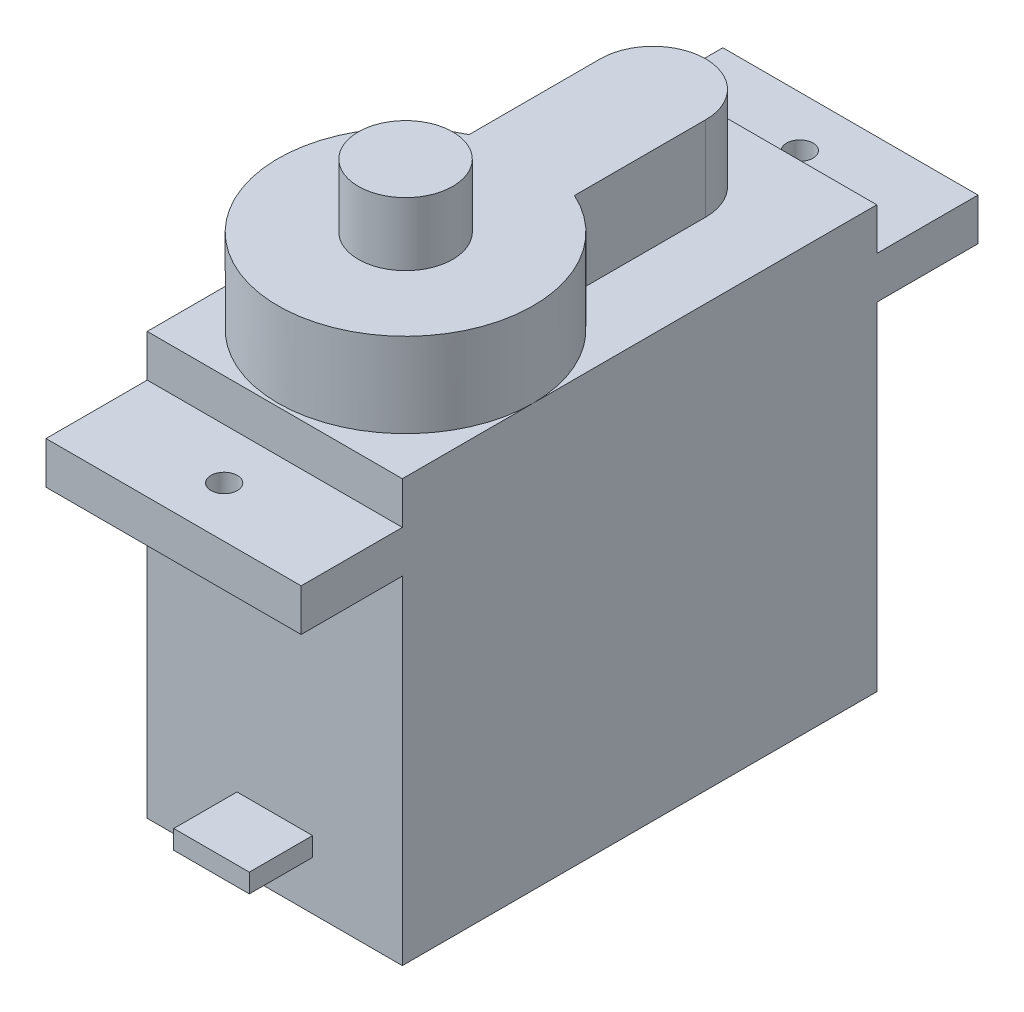
ISO-10303-21;
HEADER;
FILE_DESCRIPTION(('STEP AP214'),'2;1');
FILE_NAME('part.step','',(''),(''),'','','');
FILE_SCHEMA(('AUTOMOTIVE_DESIGN { 1 0 10303 214 1 1 1 1 }'));
ENDSEC;
DATA;
#1=APPLICATION_CONTEXT('core data for automotive mechanical design processes');
#2=APPLICATION_PROTOCOL_DEFINITION('international standard','automotive_design',2000,#1);
#3=PRODUCT_CONTEXT('',#1,'mechanical');
#4=PRODUCT('Part','Part','',(#3));
#5=PRODUCT_RELATED_PRODUCT_CATEGORY('part','',(#4));
#6=PRODUCT_DEFINITION_FORMATION('','',#4);
#7=PRODUCT_DEFINITION_CONTEXT('part definition',#1,'design');
#8=PRODUCT_DEFINITION('design','',#6,#7);
#9=PRODUCT_DEFINITION_SHAPE('','',#8);
#10=(LENGTH_UNIT() NAMED_UNIT(*) SI_UNIT(.MILLI.,.METRE.));
#11=(NAMED_UNIT(*) PLANE_ANGLE_UNIT() SI_UNIT($,.RADIAN.));
#12=(NAMED_UNIT(*) SI_UNIT($,.STERADIAN.) SOLID_ANGLE_UNIT());
#13=UNCERTAINTY_MEASURE_WITH_UNIT(LENGTH_MEASURE(1.E-05),#10,'distance_accuracy_value','');
#14=(GEOMETRIC_REPRESENTATION_CONTEXT(3) GLOBAL_UNCERTAINTY_ASSIGNED_CONTEXT((#13)) GLOBAL_UNIT_ASSIGNED_CONTEXT((#10,
#11,#12)) REPRESENTATION_CONTEXT('',''));
#15=CARTESIAN_POINT('',(0.,0.,0.));
#16=DIRECTION('',(0.,0.,1.));
#17=DIRECTION('',(1.,0.,0.));
#18=AXIS2_PLACEMENT_3D('',#15,#16,#17);
#19=CARTESIAN_POINT('',(-0.323958333333324,20.,22.6119791666667));
#20=DIRECTION('',(0.,0.,-1.));
#21=DIRECTION('',(-1.,0.,0.));
#22=AXIS2_PLACEMENT_3D('',#19,#20,#21);
#23=PLANE('',#22);
#24=DIRECTION('',(1.,0.,0.));
#25=VECTOR('',#24,1.);
#26=CARTESIAN_POINT('',(-0.323958333333323,16.,22.6119791666667));
#27=LINE('',#26,#25);
#28=CARTESIAN_POINT('',(-0.323958333333324,16.,22.6119791666667));
#29=VERTEX_POINT('',#28);
#30=CARTESIAN_POINT('',(11.7760416666667,16.,22.6119791666667));
#31=VERTEX_POINT('',#30);
#32=EDGE_CURVE('E279',#29,#31,#27,.T.);
#33=ORIENTED_EDGE('',*,*,#32,.F.);
#34=DIRECTION('',(0.,-1.,0.));
#35=VECTOR('',#34,1.);
#36=CARTESIAN_POINT('',(-0.323958333333324,20.,22.6119791666667));
#37=LINE('',#36,#35);
#38=CARTESIAN_POINT('',(-0.323958333333324,0.,22.6119791666667));
#39=VERTEX_POINT('',#38);
#40=EDGE_CURVE('E340',#29,#39,#37,.T.);
#41=ORIENTED_EDGE('',*,*,#40,.T.);
#42=DIRECTION('',(1.,0.,0.));
#43=VECTOR('',#42,1.);
#44=CARTESIAN_POINT('',(-0.323958333333324,0.,22.6119791666667));
#45=LINE('',#44,#43);
#46=CARTESIAN_POINT('',(11.7760416666667,0.,22.6119791666667));
#47=VERTEX_POINT('',#46);
#48=EDGE_CURVE('E322',#39,#47,#45,.T.);
#49=ORIENTED_EDGE('',*,*,#48,.T.);
#50=DIRECTION('',(0.,-1.,0.));
#51=VECTOR('',#50,1.);
#52=CARTESIAN_POINT('',(11.7760416666667,20.,22.6119791666667));
#53=LINE('',#52,#51);
#54=EDGE_CURVE('E337',#31,#47,#53,.T.);
#55=ORIENTED_EDGE('',*,*,#54,.F.);
#56=EDGE_LOOP('',(#33,#41,#49,#55));
#57=FACE_BOUND('',#56,.T.);
#58=DIRECTION('',(0.,1.,0.));
#59=VECTOR('',#58,1.);
#60=CARTESIAN_POINT('',(7.51809267119526,3.21293798361964,22.6119791666667));
#61=LINE('',#60,#59);
#62=CARTESIAN_POINT('',(7.51809267119526,2.31691248135534,22.6119791666667));
#63=VERTEX_POINT('',#62);
#64=CARTESIAN_POINT('',(7.51809267119526,3.21293798361964,22.6119791666667));
#65=VERTEX_POINT('',#64);
#66=EDGE_CURVE('E200',#63,#65,#61,.T.);
#67=ORIENTED_EDGE('',*,*,#66,.F.);
#68=DIRECTION('',(1.,0.,0.));
#69=VECTOR('',#68,1.);
#70=CARTESIAN_POINT('',(3.93399066213809,2.31691248135534,22.6119791666667));
#71=LINE('',#70,#69);
#72=CARTESIAN_POINT('',(3.93399066213809,2.31691248135534,22.6119791666667));
#73=VERTEX_POINT('',#72);
#74=EDGE_CURVE('E197',#73,#63,#71,.T.);
#75=ORIENTED_EDGE('',*,*,#74,.F.);
#76=DIRECTION('',(0.,-1.,0.));
#77=VECTOR('',#76,1.);
#78=CARTESIAN_POINT('',(3.93399066213809,3.21293798361964,22.6119791666667));
#79=LINE('',#78,#77);
#80=CARTESIAN_POINT('',(3.93399066213809,3.21293798361964,22.6119791666667));
#81=VERTEX_POINT('',#80);
#82=EDGE_CURVE('E57',#81,#73,#79,.T.);
#83=ORIENTED_EDGE('',*,*,#82,.F.);
#84=DIRECTION('',(-1.,0.,0.));
#85=VECTOR('',#84,1.);
#86=CARTESIAN_POINT('',(3.93399066213809,3.21293798361964,22.6119791666667));
#87=LINE('',#86,#85);
#88=EDGE_CURVE('E52',#65,#81,#87,.T.);
#89=ORIENTED_EDGE('',*,*,#88,.F.);
#90=EDGE_LOOP('',(#67,#75,#83,#89));
#91=FACE_BOUND('',#90,.T.);
#92=ADVANCED_FACE('F35',(#57,#91),#23,.F.);
#93=CARTESIAN_POINT('',(0.,20.,0.));
#94=DIRECTION('',(0.,1.,0.));
#95=DIRECTION('',(0.,0.,1.));
#96=AXIS2_PLACEMENT_3D('',#93,#94,#95);
#97=PLANE('',#96);
#98=CARTESIAN_POINT('',(5.72604166666668,20.,16.4100907388871));
#99=DIRECTION('',(0.,1.,0.));
#100=DIRECTION('',(0.,0.,1.));
#101=AXIS2_PLACEMENT_3D('',#98,#99,#100);
#102=CIRCLE('',#101,6.05);
#103=CARTESIAN_POINT('',(3.22604166666668,20.,10.900780437225));
#104=VERTEX_POINT('',#103);
#105=CARTESIAN_POINT('',(-0.323958333333323,20.,16.4100907388871));
#106=VERTEX_POINT('',#105);
#107=EDGE_CURVE('E204',#104,#106,#102,.T.);
#108=ORIENTED_EDGE('',*,*,#107,.F.);
#109=DIRECTION('',(0.,0.,1.));
#110=VECTOR('',#109,1.);
#111=CARTESIAN_POINT('',(3.22604166666668,20.,4.67601741229884));
#112=LINE('',#111,#110);
#113=CARTESIAN_POINT('',(3.22604166666668,20.,4.67601741229884));
#114=VERTEX_POINT('',#113);
#115=EDGE_CURVE('E214',#114,#104,#112,.T.);
#116=ORIENTED_EDGE('',*,*,#115,.F.);
#117=CARTESIAN_POINT('',(5.72604166666667,20.,4.67601746270815));
#118=DIRECTION('',(0.,1.,0.));
#119=DIRECTION('',(0.,0.,1.));
#120=AXIS2_PLACEMENT_3D('',#117,#118,#119);
#121=CIRCLE('',#120,2.5);
#122=CARTESIAN_POINT('',(8.22604166666667,20.,4.67601751311747));
#123=VERTEX_POINT('',#122);
#124=EDGE_CURVE('E227',#123,#114,#121,.T.);
#125=ORIENTED_EDGE('',*,*,#124,.F.);
#126=DIRECTION('',(0.,0.,-1.));
#127=VECTOR('',#126,1.);
#128=CARTESIAN_POINT('',(8.22604166666667,20.,4.67601751311747));
#129=LINE('',#128,#127);
#130=CARTESIAN_POINT('',(8.22604166666668,20.,10.900780437225));
#131=VERTEX_POINT('',#130);
#132=EDGE_CURVE('E223',#131,#123,#129,.T.);
#133=ORIENTED_EDGE('',*,*,#132,.F.);
#134=CARTESIAN_POINT('',(11.7760416666667,20.,16.4100907388871));
#135=VERTEX_POINT('',#134);
#136=EDGE_CURVE('E224',#135,#131,#102,.T.);
#137=ORIENTED_EDGE('',*,*,#136,.F.);
#138=DIRECTION('',(0.,0.,-1.));
#139=VECTOR('',#138,1.);
#140=CARTESIAN_POINT('',(11.7760416666667,20.,0.111979166666672));
#141=LINE('',#140,#139);
#142=CARTESIAN_POINT('',(11.7760416666667,20.,0.111979166666672));
#143=VERTEX_POINT('',#142);
#144=EDGE_CURVE('E313',#135,#143,#141,.T.);
#145=ORIENTED_EDGE('',*,*,#144,.T.);
#146=DIRECTION('',(-1.,0.,0.));
#147=VECTOR('',#146,1.);
#148=CARTESIAN_POINT('',(-0.323958333333326,20.,0.111979166666672));
#149=LINE('',#148,#147);
#150=CARTESIAN_POINT('',(-0.323958333333326,20.,0.111979166666672));
#151=VERTEX_POINT('',#150);
#152=EDGE_CURVE('E317',#143,#151,#149,.T.);
#153=ORIENTED_EDGE('',*,*,#152,.T.);
#154=DIRECTION('',(0.,0.,1.));
#155=VECTOR('',#154,1.);
#156=CARTESIAN_POINT('',(-0.323958333333326,20.,0.111979166666672));
#157=LINE('',#156,#155);
#158=EDGE_CURVE('E307',#151,#106,#157,.T.);
#159=ORIENTED_EDGE('',*,*,#158,.T.);
#160=EDGE_LOOP('',(#108,#116,#125,#133,#137,#145,#153,#159));
#161=FACE_BOUND('',#160,.T.);
#162=ADVANCED_FACE('F391',(#161),#97,.T.);
#163=CARTESIAN_POINT('',(-0.323958333333326,20.,0.111979166666672));
#164=DIRECTION('',(0.,0.,1.));
#165=DIRECTION('',(1.,0.,0.));
#166=AXIS2_PLACEMENT_3D('',#163,#164,#165);
#167=PLANE('',#166);
#168=DIRECTION('',(1.,0.,0.));
#169=VECTOR('',#168,1.);
#170=CARTESIAN_POINT('',(-0.323958333333328,18.,0.111979166666672));
#171=LINE('',#170,#169);
#172=CARTESIAN_POINT('',(-0.323958333333326,18.,0.111979166666672));
#173=VERTEX_POINT('',#172);
#174=CARTESIAN_POINT('',(11.7760416666667,18.,0.111979166666672));
#175=VERTEX_POINT('',#174);
#176=EDGE_CURVE('E252',#173,#175,#171,.T.);
#177=ORIENTED_EDGE('',*,*,#176,.F.);
#178=DIRECTION('',(0.,-1.,0.));
#179=VECTOR('',#178,1.);
#180=CARTESIAN_POINT('',(-0.323958333333326,20.,0.111979166666672));
#181=LINE('',#180,#179);
#182=EDGE_CURVE('E331',#151,#173,#181,.T.);
#183=ORIENTED_EDGE('',*,*,#182,.F.);
#184=ORIENTED_EDGE('',*,*,#152,.F.);
#185=DIRECTION('',(0.,-1.,0.));
#186=VECTOR('',#185,1.);
#187=CARTESIAN_POINT('',(11.7760416666667,20.,0.111979166666672));
#188=LINE('',#187,#186);
#189=EDGE_CURVE('E335',#143,#175,#188,.T.);
#190=ORIENTED_EDGE('',*,*,#189,.T.);
#191=EDGE_LOOP('',(#177,#183,#184,#190));
#192=FACE_BOUND('',#191,.T.);
#193=ADVANCED_FACE('F422',(#192),#167,.F.);
#194=DIRECTION('',(-1.,0.,0.));
#195=VECTOR('',#194,1.);
#196=CARTESIAN_POINT('',(11.7760416666667,16.,0.11197916666667));
#197=LINE('',#196,#195);
#198=CARTESIAN_POINT('',(11.7760416666667,16.,0.111979166666672));
#199=VERTEX_POINT('',#198);
#200=CARTESIAN_POINT('',(-0.323958333333327,16.,0.111979166666672));
#201=VERTEX_POINT('',#200);
#202=EDGE_CURVE('E257',#199,#201,#197,.T.);
#203=ORIENTED_EDGE('',*,*,#202,.F.);
#204=CARTESIAN_POINT('',(11.7760416666667,0.,0.111979166666672));
#205=VERTEX_POINT('',#204);
#206=EDGE_CURVE('E334',#199,#205,#188,.T.);
#207=ORIENTED_EDGE('',*,*,#206,.T.);
#208=DIRECTION('',(-1.,0.,0.));
#209=VECTOR('',#208,1.);
#210=CARTESIAN_POINT('',(-0.323958333333326,0.,0.111979166666672));
#211=LINE('',#210,#209);
#212=CARTESIAN_POINT('',(-0.323958333333326,0.,0.111979166666672));
#213=VERTEX_POINT('',#212);
#214=EDGE_CURVE('E328',#205,#213,#211,.T.);
#215=ORIENTED_EDGE('',*,*,#214,.T.);
#216=EDGE_CURVE('E319',#201,#213,#181,.T.);
#217=ORIENTED_EDGE('',*,*,#216,.F.);
#218=EDGE_LOOP('',(#203,#207,#215,#217));
#219=FACE_BOUND('',#218,.T.);
#220=ADVANCED_FACE('F359',(#219),#167,.F.);
#221=DIRECTION('',(-1.,0.,0.));
#222=VECTOR('',#221,1.);
#223=CARTESIAN_POINT('',(-0.323958333333324,18.,22.6119791666667));
#224=LINE('',#223,#222);
#225=CARTESIAN_POINT('',(11.7760416666667,18.,22.6119791666667));
#226=VERTEX_POINT('',#225);
#227=CARTESIAN_POINT('',(-0.323958333333324,18.,22.6119791666667));
#228=VERTEX_POINT('',#227);
#229=EDGE_CURVE('E284',#226,#228,#224,.T.);
#230=ORIENTED_EDGE('',*,*,#229,.F.);
#231=CARTESIAN_POINT('',(11.7760416666667,20.,22.6119791666667));
#232=VERTEX_POINT('',#231);
#233=EDGE_CURVE('E338',#232,#226,#53,.T.);
#234=ORIENTED_EDGE('',*,*,#233,.F.);
#235=DIRECTION('',(1.,0.,0.));
#236=VECTOR('',#235,1.);
#237=CARTESIAN_POINT('',(-0.323958333333324,20.,22.6119791666667));
#238=LINE('',#237,#236);
#239=CARTESIAN_POINT('',(-0.323958333333324,20.,22.6119791666667));
#240=VERTEX_POINT('',#239);
#241=EDGE_CURVE('E310',#240,#232,#238,.T.);
#242=ORIENTED_EDGE('',*,*,#241,.F.);
#243=EDGE_CURVE('E341',#240,#228,#37,.T.);
#244=ORIENTED_EDGE('',*,*,#243,.T.);
#245=EDGE_LOOP('',(#230,#234,#242,#244));
#246=FACE_BOUND('',#245,.T.);
#247=ADVANCED_FACE('F377',(#246),#23,.F.);
#248=CARTESIAN_POINT('',(-0.323958333333326,20.,0.111979166666672));
#249=DIRECTION('',(1.,0.,0.));
#250=DIRECTION('',(0.,0.,-1.));
#251=AXIS2_PLACEMENT_3D('',#248,#249,#250);
#252=PLANE('',#251);
#253=DIRECTION('',(0.,0.,1.));
#254=VECTOR('',#253,1.);
#255=CARTESIAN_POINT('',(-0.323958333333326,0.,0.111979166666672));
#256=LINE('',#255,#254);
#257=EDGE_CURVE('E306',#213,#39,#256,.T.);
#258=ORIENTED_EDGE('',*,*,#257,.T.);
#259=ORIENTED_EDGE('',*,*,#40,.F.);
#260=DIRECTION('',(0.,0.,-1.));
#261=VECTOR('',#260,1.);
#262=CARTESIAN_POINT('',(-0.323958333333323,16.,27.4119791666667));
#263=LINE('',#262,#261);
#264=CARTESIAN_POINT('',(-0.323958333333323,16.,27.4119791666667));
#265=VERTEX_POINT('',#264);
#266=EDGE_CURVE('E303',#265,#29,#263,.T.);
#267=ORIENTED_EDGE('',*,*,#266,.F.);
#268=DIRECTION('',(0.,-1.,0.));
#269=VECTOR('',#268,1.);
#270=CARTESIAN_POINT('',(-0.323958333333324,18.,27.4119791666667));
#271=LINE('',#270,#269);
#272=CARTESIAN_POINT('',(-0.323958333333324,18.,27.4119791666667));
#273=VERTEX_POINT('',#272);
#274=EDGE_CURVE('E280',#273,#265,#271,.T.);
#275=ORIENTED_EDGE('',*,*,#274,.F.);
#276=DIRECTION('',(0.,0.,-1.));
#277=VECTOR('',#276,1.);
#278=CARTESIAN_POINT('',(-0.323958333333324,18.,27.4119791666667));
#279=LINE('',#278,#277);
#280=EDGE_CURVE('E290',#273,#228,#279,.T.);
#281=ORIENTED_EDGE('',*,*,#280,.T.);
#282=ORIENTED_EDGE('',*,*,#243,.F.);
#283=EDGE_CURVE('E311',#106,#240,#157,.T.);
#284=ORIENTED_EDGE('',*,*,#283,.F.);
#285=ORIENTED_EDGE('',*,*,#158,.F.);
#286=ORIENTED_EDGE('',*,*,#182,.T.);
#287=DIRECTION('',(0.,0.,1.));
#288=VECTOR('',#287,1.);
#289=CARTESIAN_POINT('',(-0.323958333333328,18.,-4.68802083333333));
#290=LINE('',#289,#288);
#291=CARTESIAN_POINT('',(-0.323958333333328,18.,-4.68802083333333));
#292=VERTEX_POINT('',#291);
#293=EDGE_CURVE('E263',#292,#173,#290,.T.);
#294=ORIENTED_EDGE('',*,*,#293,.F.);
#295=DIRECTION('',(0.,1.,0.));
#296=VECTOR('',#295,1.);
#297=CARTESIAN_POINT('',(-0.323958333333328,16.,-4.68802083333333));
#298=LINE('',#297,#296);
#299=CARTESIAN_POINT('',(-0.323958333333328,16.,-4.68802083333333));
#300=VERTEX_POINT('',#299);
#301=EDGE_CURVE('E261',#300,#292,#298,.T.);
#302=ORIENTED_EDGE('',*,*,#301,.F.);
#303=DIRECTION('',(0.,0.,1.));
#304=VECTOR('',#303,1.);
#305=CARTESIAN_POINT('',(-0.323958333333328,16.,-4.68802083333333));
#306=LINE('',#305,#304);
#307=EDGE_CURVE('E270',#300,#201,#306,.T.);
#308=ORIENTED_EDGE('',*,*,#307,.T.);
#309=ORIENTED_EDGE('',*,*,#216,.T.);
#310=EDGE_LOOP('',(#258,#259,#267,#275,#281,#282,#284,#285,#286,#294,#302,#308,#309));
#311=FACE_BOUND('',#310,.T.);
#312=ADVANCED_FACE('F37',(#311),#252,.F.);
#313=CARTESIAN_POINT('',(11.7760416666667,20.,0.111979166666672));
#314=DIRECTION('',(-1.,0.,0.));
#315=DIRECTION('',(0.,0.,1.));
#316=AXIS2_PLACEMENT_3D('',#313,#314,#315);
#317=PLANE('',#316);
#318=DIRECTION('',(0.,0.,-1.));
#319=VECTOR('',#318,1.);
#320=CARTESIAN_POINT('',(11.7760416666667,0.,0.111979166666672));
#321=LINE('',#320,#319);
#322=EDGE_CURVE('E325',#47,#205,#321,.T.);
#323=ORIENTED_EDGE('',*,*,#322,.T.);
#324=ORIENTED_EDGE('',*,*,#206,.F.);
#325=DIRECTION('',(0.,0.,1.));
#326=VECTOR('',#325,1.);
#327=CARTESIAN_POINT('',(11.7760416666667,16.,-4.68802083333333));
#328=LINE('',#327,#326);
#329=CARTESIAN_POINT('',(11.7760416666667,16.,-4.68802083333333));
#330=VERTEX_POINT('',#329);
#331=EDGE_CURVE('E273',#330,#199,#328,.T.);
#332=ORIENTED_EDGE('',*,*,#331,.F.);
#333=DIRECTION('',(0.,-1.,0.));
#334=VECTOR('',#333,1.);
#335=CARTESIAN_POINT('',(11.7760416666667,18.,-4.68802083333333));
#336=LINE('',#335,#334);
#337=CARTESIAN_POINT('',(11.7760416666667,18.,-4.68802083333333));
#338=VERTEX_POINT('',#337);
#339=EDGE_CURVE('E256',#338,#330,#336,.T.);
#340=ORIENTED_EDGE('',*,*,#339,.F.);
#341=DIRECTION('',(0.,0.,1.));
#342=VECTOR('',#341,1.);
#343=CARTESIAN_POINT('',(11.7760416666667,18.,-4.68802083333333));
#344=LINE('',#343,#342);
#345=EDGE_CURVE('E276',#338,#175,#344,.T.);
#346=ORIENTED_EDGE('',*,*,#345,.T.);
#347=ORIENTED_EDGE('',*,*,#189,.F.);
#348=ORIENTED_EDGE('',*,*,#144,.F.);
#349=EDGE_CURVE('E314',#232,#135,#141,.T.);
#350=ORIENTED_EDGE('',*,*,#349,.F.);
#351=ORIENTED_EDGE('',*,*,#233,.T.);
#352=DIRECTION('',(0.,0.,-1.));
#353=VECTOR('',#352,1.);
#354=CARTESIAN_POINT('',(11.7760416666667,18.,27.4119791666667));
#355=LINE('',#354,#353);
#356=CARTESIAN_POINT('',(11.7760416666667,18.,27.4119791666667));
#357=VERTEX_POINT('',#356);
#358=EDGE_CURVE('E297',#357,#226,#355,.T.);
#359=ORIENTED_EDGE('',*,*,#358,.F.);
#360=DIRECTION('',(0.,1.,0.));
#361=VECTOR('',#360,1.);
#362=CARTESIAN_POINT('',(11.7760416666667,18.,27.4119791666667));
#363=LINE('',#362,#361);
#364=CARTESIAN_POINT('',(11.7760416666667,16.,27.4119791666667));
#365=VERTEX_POINT('',#364);
#366=EDGE_CURVE('E286',#365,#357,#363,.T.);
#367=ORIENTED_EDGE('',*,*,#366,.F.);
#368=DIRECTION('',(0.,0.,-1.));
#369=VECTOR('',#368,1.);
#370=CARTESIAN_POINT('',(11.7760416666667,16.,27.4119791666667));
#371=LINE('',#370,#369);
#372=EDGE_CURVE('E300',#365,#31,#371,.T.);
#373=ORIENTED_EDGE('',*,*,#372,.T.);
#374=ORIENTED_EDGE('',*,*,#54,.T.);
#375=EDGE_LOOP('',(#323,#324,#332,#340,#346,#347,#348,#350,#351,#359,#367,#373,#374));
#376=FACE_BOUND('',#375,.T.);
#377=ADVANCED_FACE('F363',(#376),#317,.F.);
#378=EDGE_CURVE('E44',#106,#135,#102,.T.);
#379=ORIENTED_EDGE('',*,*,#378,.F.);
#380=ORIENTED_EDGE('',*,*,#283,.T.);
#381=ORIENTED_EDGE('',*,*,#241,.T.);
#382=ORIENTED_EDGE('',*,*,#349,.T.);
#383=EDGE_LOOP('',(#379,#380,#381,#382));
#384=FACE_BOUND('',#383,.T.);
#385=ADVANCED_FACE('F383',(#384),#97,.T.);
#386=CARTESIAN_POINT('',(0.,0.,0.));
#387=DIRECTION('',(0.,1.,0.));
#388=DIRECTION('',(0.,0.,1.));
#389=AXIS2_PLACEMENT_3D('',#386,#387,#388);
#390=PLANE('',#389);
#391=ORIENTED_EDGE('',*,*,#257,.F.);
#392=ORIENTED_EDGE('',*,*,#214,.F.);
#393=ORIENTED_EDGE('',*,*,#322,.F.);
#394=ORIENTED_EDGE('',*,*,#48,.F.);
#395=EDGE_LOOP('',(#391,#392,#393,#394));
#396=FACE_BOUND('',#395,.T.);
#397=ADVANCED_FACE('F354',(#396),#390,.F.);
#398=CARTESIAN_POINT('',(-0.323958333333323,16.,27.4119791666667));
#399=DIRECTION('',(0.,1.,0.));
#400=DIRECTION('',(0.,0.,1.));
#401=AXIS2_PLACEMENT_3D('',#398,#399,#400);
#402=PLANE('',#401);
#403=CARTESIAN_POINT('',(5.72604166666668,16.,25.0119791666667));
#404=DIRECTION('',(0.,1.,0.));
#405=DIRECTION('',(0.,0.,1.));
#406=AXIS2_PLACEMENT_3D('',#403,#404,#405);
#407=CIRCLE('',#406,0.625);
#408=CARTESIAN_POINT('',(5.72604166666668,16.,25.6369791666667));
#409=VERTEX_POINT('',#408);
#410=EDGE_CURVE('E249',#409,#409,#407,.T.);
#411=ORIENTED_EDGE('',*,*,#410,.T.);
#412=EDGE_LOOP('',(#411));
#413=FACE_BOUND('',#412,.T.);
#414=ORIENTED_EDGE('',*,*,#32,.T.);
#415=ORIENTED_EDGE('',*,*,#372,.F.);
#416=DIRECTION('',(1.,0.,0.));
#417=VECTOR('',#416,1.);
#418=CARTESIAN_POINT('',(-0.323958333333323,16.,27.4119791666667));
#419=LINE('',#418,#417);
#420=EDGE_CURVE('E283',#265,#365,#419,.T.);
#421=ORIENTED_EDGE('',*,*,#420,.F.);
#422=ORIENTED_EDGE('',*,*,#266,.T.);
#423=EDGE_LOOP('',(#414,#415,#421,#422));
#424=FACE_BOUND('',#423,.T.);
#425=ADVANCED_FACE('F367',(#413,#424),#402,.F.);
#426=CARTESIAN_POINT('',(-0.323958333333324,18.,27.4119791666667));
#427=DIRECTION('',(0.,-1.,0.));
#428=DIRECTION('',(0.,0.,-1.));
#429=AXIS2_PLACEMENT_3D('',#426,#427,#428);
#430=PLANE('',#429);
#431=CARTESIAN_POINT('',(5.72604166666668,18.,25.0119791666667));
#432=DIRECTION('',(0.,1.,0.));
#433=DIRECTION('',(0.,0.,1.));
#434=AXIS2_PLACEMENT_3D('',#431,#432,#433);
#435=CIRCLE('',#434,0.625);
#436=CARTESIAN_POINT('',(5.72604166666668,18.,25.6369791666667));
#437=VERTEX_POINT('',#436);
#438=EDGE_CURVE('E243',#437,#437,#435,.T.);
#439=ORIENTED_EDGE('',*,*,#438,.F.);
#440=EDGE_LOOP('',(#439));
#441=FACE_BOUND('',#440,.T.);
#442=ORIENTED_EDGE('',*,*,#229,.T.);
#443=ORIENTED_EDGE('',*,*,#280,.F.);
#444=DIRECTION('',(-1.,0.,0.));
#445=VECTOR('',#444,1.);
#446=CARTESIAN_POINT('',(-0.323958333333324,18.,27.4119791666667));
#447=LINE('',#446,#445);
#448=EDGE_CURVE('E288',#357,#273,#447,.T.);
#449=ORIENTED_EDGE('',*,*,#448,.F.);
#450=ORIENTED_EDGE('',*,*,#358,.T.);
#451=EDGE_LOOP('',(#442,#443,#449,#450));
#452=FACE_BOUND('',#451,.T.);
#453=ADVANCED_FACE('F375',(#441,#452),#430,.F.);
#454=CARTESIAN_POINT('',(0.,0.,27.4119791666667));
#455=DIRECTION('',(0.,0.,1.));
#456=DIRECTION('',(1.,0.,0.));
#457=AXIS2_PLACEMENT_3D('',#454,#455,#456);
#458=PLANE('',#457);
#459=ORIENTED_EDGE('',*,*,#274,.T.);
#460=ORIENTED_EDGE('',*,*,#420,.T.);
#461=ORIENTED_EDGE('',*,*,#366,.T.);
#462=ORIENTED_EDGE('',*,*,#448,.T.);
#463=EDGE_LOOP('',(#459,#460,#461,#462));
#464=FACE_BOUND('',#463,.T.);
#465=ADVANCED_FACE('F371',(#464),#458,.T.);
#466=CARTESIAN_POINT('',(-0.323958333333328,18.,-4.68802083333333));
#467=DIRECTION('',(0.,-1.,0.));
#468=DIRECTION('',(0.,0.,-1.));
#469=AXIS2_PLACEMENT_3D('',#466,#467,#468);
#470=PLANE('',#469);
#471=CARTESIAN_POINT('',(5.72604166666667,18.,-2.28802083333333));
#472=DIRECTION('',(0.,1.,0.));
#473=DIRECTION('',(0.,0.,1.));
#474=AXIS2_PLACEMENT_3D('',#471,#472,#473);
#475=CIRCLE('',#474,0.625);
#476=CARTESIAN_POINT('',(5.72604166666667,18.,-1.66302083333333));
#477=VERTEX_POINT('',#476);
#478=EDGE_CURVE('E244',#477,#477,#475,.T.);
#479=ORIENTED_EDGE('',*,*,#478,.F.);
#480=EDGE_LOOP('',(#479));
#481=FACE_BOUND('',#480,.T.);
#482=ORIENTED_EDGE('',*,*,#176,.T.);
#483=ORIENTED_EDGE('',*,*,#345,.F.);
#484=DIRECTION('',(1.,0.,0.));
#485=VECTOR('',#484,1.);
#486=CARTESIAN_POINT('',(-0.323958333333328,18.,-4.68802083333333));
#487=LINE('',#486,#485);
#488=EDGE_CURVE('E253',#292,#338,#487,.T.);
#489=ORIENTED_EDGE('',*,*,#488,.F.);
#490=ORIENTED_EDGE('',*,*,#293,.T.);
#491=EDGE_LOOP('',(#482,#483,#489,#490));
#492=FACE_BOUND('',#491,.T.);
#493=ADVANCED_FACE('F452',(#481,#492),#470,.F.);
#494=CARTESIAN_POINT('',(11.7760416666667,16.,-4.68802083333333));
#495=DIRECTION('',(0.,1.,0.));
#496=DIRECTION('',(0.,0.,1.));
#497=AXIS2_PLACEMENT_3D('',#494,#495,#496);
#498=PLANE('',#497);
#499=CARTESIAN_POINT('',(5.72604166666667,16.,-2.28802083333333));
#500=DIRECTION('',(0.,1.,0.));
#501=DIRECTION('',(0.,0.,1.));
#502=AXIS2_PLACEMENT_3D('',#499,#500,#501);
#503=CIRCLE('',#502,0.625);
#504=CARTESIAN_POINT('',(5.72604166666667,16.,-1.66302083333333));
#505=VERTEX_POINT('',#504);
#506=EDGE_CURVE('E39',#505,#505,#503,.T.);
#507=ORIENTED_EDGE('',*,*,#506,.T.);
#508=EDGE_LOOP('',(#507));
#509=FACE_BOUND('',#508,.T.);
#510=ORIENTED_EDGE('',*,*,#202,.T.);
#511=ORIENTED_EDGE('',*,*,#307,.F.);
#512=DIRECTION('',(-1.,0.,0.));
#513=VECTOR('',#512,1.);
#514=CARTESIAN_POINT('',(11.7760416666667,16.,-4.68802083333333));
#515=LINE('',#514,#513);
#516=EDGE_CURVE('E259',#330,#300,#515,.T.);
#517=ORIENTED_EDGE('',*,*,#516,.F.);
#518=ORIENTED_EDGE('',*,*,#331,.T.);
#519=EDGE_LOOP('',(#510,#511,#517,#518));
#520=FACE_BOUND('',#519,.T.);
#521=ADVANCED_FACE('F455',(#509,#520),#498,.F.);
#522=CARTESIAN_POINT('',(0.,0.,-4.68802083333333));
#523=DIRECTION('',(0.,0.,-1.));
#524=DIRECTION('',(-1.,0.,0.));
#525=AXIS2_PLACEMENT_3D('',#522,#523,#524);
#526=PLANE('',#525);
#527=ORIENTED_EDGE('',*,*,#488,.T.);
#528=ORIENTED_EDGE('',*,*,#339,.T.);
#529=ORIENTED_EDGE('',*,*,#516,.T.);
#530=ORIENTED_EDGE('',*,*,#301,.T.);
#531=EDGE_LOOP('',(#527,#528,#529,#530));
#532=FACE_BOUND('',#531,.T.);
#533=ADVANCED_FACE('F459',(#532),#526,.T.);
#534=CARTESIAN_POINT('',(5.72604166666667,0.,-2.28802083333333));
#535=DIRECTION('',(0.,1.,0.));
#536=DIRECTION('',(0.,0.,1.));
#537=AXIS2_PLACEMENT_3D('',#534,#535,#536);
#538=CYLINDRICAL_SURFACE('',#537,0.625);
#539=ORIENTED_EDGE('',*,*,#478,.T.);
#540=EDGE_LOOP('',(#539));
#541=FACE_BOUND('',#540,.T.);
#542=ORIENTED_EDGE('',*,*,#506,.F.);
#543=EDGE_LOOP('',(#542));
#544=FACE_BOUND('',#543,.T.);
#545=ADVANCED_FACE('F463',(#541,#544),#538,.F.);
#546=CARTESIAN_POINT('',(5.72604166666668,0.,25.0119791666667));
#547=DIRECTION('',(0.,1.,0.));
#548=DIRECTION('',(0.,0.,1.));
#549=AXIS2_PLACEMENT_3D('',#546,#547,#548);
#550=CYLINDRICAL_SURFACE('',#549,0.625);
#551=ORIENTED_EDGE('',*,*,#438,.T.);
#552=EDGE_LOOP('',(#551));
#553=FACE_BOUND('',#552,.T.);
#554=ORIENTED_EDGE('',*,*,#410,.F.);
#555=EDGE_LOOP('',(#554));
#556=FACE_BOUND('',#555,.T.);
#557=ADVANCED_FACE('F465',(#553,#556),#550,.F.);
#558=CARTESIAN_POINT('',(5.72604166666668,24.,16.4100907388871));
#559=DIRECTION('',(0.,-1.,0.));
#560=DIRECTION('',(0.,0.,-1.));
#561=AXIS2_PLACEMENT_3D('',#558,#559,#560);
#562=CYLINDRICAL_SURFACE('',#561,6.05);
#563=ORIENTED_EDGE('',*,*,#107,.T.);
#564=ORIENTED_EDGE('',*,*,#378,.T.);
#565=ORIENTED_EDGE('',*,*,#136,.T.);
#566=DIRECTION('',(0.,-1.,0.));
#567=VECTOR('',#566,1.);
#568=CARTESIAN_POINT('',(8.22604166666668,24.,10.900780437225));
#569=LINE('',#568,#567);
#570=CARTESIAN_POINT('',(8.22604166666668,24.,10.900780437225));
#571=VERTEX_POINT('',#570);
#572=EDGE_CURVE('E240',#571,#131,#569,.T.);
#573=ORIENTED_EDGE('',*,*,#572,.F.);
#574=CARTESIAN_POINT('',(5.72604166666668,24.,16.4100907388871));
#575=DIRECTION('',(0.,1.,0.));
#576=DIRECTION('',(0.,0.,1.));
#577=AXIS2_PLACEMENT_3D('',#574,#575,#576);
#578=CIRCLE('',#577,6.05);
#579=CARTESIAN_POINT('',(3.22604166666668,24.,10.900780437225));
#580=VERTEX_POINT('',#579);
#581=EDGE_CURVE('E210',#580,#571,#578,.T.);
#582=ORIENTED_EDGE('',*,*,#581,.F.);
#583=DIRECTION('',(0.,-1.,0.));
#584=VECTOR('',#583,1.);
#585=CARTESIAN_POINT('',(3.22604166666668,24.,10.900780437225));
#586=LINE('',#585,#584);
#587=EDGE_CURVE('E220',#580,#104,#586,.T.);
#588=ORIENTED_EDGE('',*,*,#587,.T.);
#589=EDGE_LOOP('',(#563,#564,#565,#573,#582,#588));
#590=FACE_BOUND('',#589,.T.);
#591=ADVANCED_FACE('F386',(#590),#562,.T.);
#592=CARTESIAN_POINT('',(8.22604166666667,24.,4.67601751311747));
#593=DIRECTION('',(-1.,0.,0.));
#594=DIRECTION('',(0.,0.,1.));
#595=AXIS2_PLACEMENT_3D('',#592,#593,#594);
#596=PLANE('',#595);
#597=ORIENTED_EDGE('',*,*,#132,.T.);
#598=DIRECTION('',(0.,-1.,0.));
#599=VECTOR('',#598,1.);
#600=CARTESIAN_POINT('',(8.22604166666667,24.,4.67601751311747));
#601=LINE('',#600,#599);
#602=CARTESIAN_POINT('',(8.22604166666667,24.,4.67601751311747));
#603=VERTEX_POINT('',#602);
#604=EDGE_CURVE('E237',#603,#123,#601,.T.);
#605=ORIENTED_EDGE('',*,*,#604,.F.);
#606=DIRECTION('',(0.,0.,-1.));
#607=VECTOR('',#606,1.);
#608=CARTESIAN_POINT('',(8.22604166666667,24.,4.67601751311747));
#609=LINE('',#608,#607);
#610=EDGE_CURVE('E213',#571,#603,#609,.T.);
#611=ORIENTED_EDGE('',*,*,#610,.F.);
#612=ORIENTED_EDGE('',*,*,#572,.T.);
#613=EDGE_LOOP('',(#597,#605,#611,#612));
#614=FACE_BOUND('',#613,.T.);
#615=ADVANCED_FACE('F402',(#614),#596,.F.);
#616=CARTESIAN_POINT('',(5.72604166666667,24.,4.67601746270815));
#617=DIRECTION('',(0.,-1.,0.));
#618=DIRECTION('',(0.,0.,-1.));
#619=AXIS2_PLACEMENT_3D('',#616,#617,#618);
#620=CYLINDRICAL_SURFACE('',#619,2.5);
#621=ORIENTED_EDGE('',*,*,#124,.T.);
#622=DIRECTION('',(0.,-1.,0.));
#623=VECTOR('',#622,1.);
#624=CARTESIAN_POINT('',(3.22604166666668,24.,4.67601741229884));
#625=LINE('',#624,#623);
#626=CARTESIAN_POINT('',(3.22604166666668,24.,4.67601741229884));
#627=VERTEX_POINT('',#626);
#628=EDGE_CURVE('E234',#627,#114,#625,.T.);
#629=ORIENTED_EDGE('',*,*,#628,.F.);
#630=CARTESIAN_POINT('',(5.72604166666667,24.,4.67601746270815));
#631=DIRECTION('',(0.,1.,0.));
#632=DIRECTION('',(0.,0.,1.));
#633=AXIS2_PLACEMENT_3D('',#630,#631,#632);
#634=CIRCLE('',#633,2.5);
#635=EDGE_CURVE('E216',#603,#627,#634,.T.);
#636=ORIENTED_EDGE('',*,*,#635,.F.);
#637=ORIENTED_EDGE('',*,*,#604,.T.);
#638=EDGE_LOOP('',(#621,#629,#636,#637));
#639=FACE_BOUND('',#638,.T.);
#640=ADVANCED_FACE('F399',(#639),#620,.T.);
#641=CARTESIAN_POINT('',(3.22604166666668,24.,4.67601741229884));
#642=DIRECTION('',(1.,0.,0.));
#643=DIRECTION('',(0.,0.,-1.));
#644=AXIS2_PLACEMENT_3D('',#641,#642,#643);
#645=PLANE('',#644);
#646=ORIENTED_EDGE('',*,*,#115,.T.);
#647=ORIENTED_EDGE('',*,*,#587,.F.);
#648=DIRECTION('',(0.,0.,1.));
#649=VECTOR('',#648,1.);
#650=CARTESIAN_POINT('',(3.22604166666668,24.,4.67601741229884));
#651=LINE('',#650,#649);
#652=EDGE_CURVE('E218',#627,#580,#651,.T.);
#653=ORIENTED_EDGE('',*,*,#652,.F.);
#654=ORIENTED_EDGE('',*,*,#628,.T.);
#655=EDGE_LOOP('',(#646,#647,#653,#654));
#656=FACE_BOUND('',#655,.T.);
#657=ADVANCED_FACE('F394',(#656),#645,.F.);
#658=CARTESIAN_POINT('',(5.72604166666668,24.,16.4100907388871));
#659=DIRECTION('',(0.,1.,0.));
#660=DIRECTION('',(0.,0.,1.));
#661=AXIS2_PLACEMENT_3D('',#658,#659,#660);
#662=PLANE('',#661);
#663=CARTESIAN_POINT('',(5.72604166666668,24.,16.4100907388871));
#664=DIRECTION('',(0.,1.,0.));
#665=DIRECTION('',(0.,0.,1.));
#666=AXIS2_PLACEMENT_3D('',#663,#664,#665);
#667=CIRCLE('',#666,2.23924192269855);
#668=CARTESIAN_POINT('',(5.72604166666668,24.,18.6493326615857));
#669=VERTEX_POINT('',#668);
#670=EDGE_CURVE('E11',#669,#669,#667,.T.);
#671=ORIENTED_EDGE('',*,*,#670,.F.);
#672=EDGE_LOOP('',(#671));
#673=FACE_BOUND('',#672,.T.);
#674=ORIENTED_EDGE('',*,*,#581,.T.);
#675=ORIENTED_EDGE('',*,*,#610,.T.);
#676=ORIENTED_EDGE('',*,*,#635,.T.);
#677=ORIENTED_EDGE('',*,*,#652,.T.);
#678=EDGE_LOOP('',(#674,#675,#676,#677));
#679=FACE_BOUND('',#678,.T.);
#680=ADVANCED_FACE('F404',(#673,#679),#662,.T.);
#681=CARTESIAN_POINT('',(5.72604166666668,27.,16.4100907388871));
#682=DIRECTION('',(0.,-1.,0.));
#683=DIRECTION('',(0.,0.,-1.));
#684=AXIS2_PLACEMENT_3D('',#681,#682,#683);
#685=CYLINDRICAL_SURFACE('',#684,2.23924192269855);
#686=CARTESIAN_POINT('',(5.72604166666668,27.,16.4100907388871));
#687=DIRECTION('',(0.,1.,0.));
#688=DIRECTION('',(0.,0.,1.));
#689=AXIS2_PLACEMENT_3D('',#686,#687,#688);
#690=CIRCLE('',#689,2.23924192269855);
#691=CARTESIAN_POINT('',(5.72604166666668,27.,18.6493326615857));
#692=VERTEX_POINT('',#691);
#693=EDGE_CURVE('E201',#692,#692,#690,.T.);
#694=ORIENTED_EDGE('',*,*,#693,.F.);
#695=EDGE_LOOP('',(#694));
#696=FACE_BOUND('',#695,.T.);
#697=ORIENTED_EDGE('',*,*,#670,.T.);
#698=EDGE_LOOP('',(#697));
#699=FACE_BOUND('',#698,.T.);
#700=ADVANCED_FACE('F406',(#696,#699),#685,.T.);
#701=CARTESIAN_POINT('',(5.72604166666668,27.,16.4100907388871));
#702=DIRECTION('',(0.,1.,0.));
#703=DIRECTION('',(0.,0.,1.));
#704=AXIS2_PLACEMENT_3D('',#701,#702,#703);
#705=PLANE('',#704);
#706=ORIENTED_EDGE('',*,*,#693,.T.);
#707=EDGE_LOOP('',(#706));
#708=FACE_BOUND('',#707,.T.);
#709=ADVANCED_FACE('F413',(#708),#705,.T.);
#710=CARTESIAN_POINT('',(7.51809267119526,3.21293798361964,25.6119791666667));
#711=DIRECTION('',(-1.,0.,0.));
#712=DIRECTION('',(0.,0.,1.));
#713=AXIS2_PLACEMENT_3D('',#710,#711,#712);
#714=PLANE('',#713);
#715=ORIENTED_EDGE('',*,*,#66,.T.);
#716=DIRECTION('',(0.,0.,-1.));
#717=VECTOR('',#716,1.);
#718=CARTESIAN_POINT('',(7.51809267119526,3.21293798361964,25.6119791666667));
#719=LINE('',#718,#717);
#720=CARTESIAN_POINT('',(7.51809267119526,3.21293798361964,25.6119791666667));
#721=VERTEX_POINT('',#720);
#722=EDGE_CURVE('E181',#721,#65,#719,.T.);
#723=ORIENTED_EDGE('',*,*,#722,.F.);
#724=DIRECTION('',(0.,1.,0.));
#725=VECTOR('',#724,1.);
#726=CARTESIAN_POINT('',(7.51809267119526,3.21293798361964,25.6119791666667));
#727=LINE('',#726,#725);
#728=CARTESIAN_POINT('',(7.51809267119526,2.31691248135534,25.6119791666667));
#729=VERTEX_POINT('',#728);
#730=EDGE_CURVE('E188',#729,#721,#727,.T.);
#731=ORIENTED_EDGE('',*,*,#730,.F.);
#732=DIRECTION('',(0.,0.,-1.));
#733=VECTOR('',#732,1.);
#734=CARTESIAN_POINT('',(7.51809267119526,2.31691248135534,25.6119791666667));
#735=LINE('',#734,#733);
#736=EDGE_CURVE('E558',#729,#63,#735,.T.);
#737=ORIENTED_EDGE('',*,*,#736,.T.);
#738=EDGE_LOOP('',(#715,#723,#731,#737));
#739=FACE_BOUND('',#738,.T.);
#740=ADVANCED_FACE('F199',(#739),#714,.F.);
#741=CARTESIAN_POINT('',(3.93399066213809,3.21293798361964,25.6119791666667));
#742=DIRECTION('',(0.,-1.,0.));
#743=DIRECTION('',(0.,0.,-1.));
#744=AXIS2_PLACEMENT_3D('',#741,#742,#743);
#745=PLANE('',#744);
#746=ORIENTED_EDGE('',*,*,#88,.T.);
#747=DIRECTION('',(0.,0.,-1.));
#748=VECTOR('',#747,1.);
#749=CARTESIAN_POINT('',(3.93399066213809,3.21293798361964,25.6119791666667));
#750=LINE('',#749,#748);
#751=CARTESIAN_POINT('',(3.93399066213809,3.21293798361964,25.6119791666667));
#752=VERTEX_POINT('',#751);
#753=EDGE_CURVE('E184',#752,#81,#750,.T.);
#754=ORIENTED_EDGE('',*,*,#753,.F.);
#755=DIRECTION('',(-1.,0.,0.));
#756=VECTOR('',#755,1.);
#757=CARTESIAN_POINT('',(3.93399066213809,3.21293798361964,25.6119791666667));
#758=LINE('',#757,#756);
#759=EDGE_CURVE('E177',#721,#752,#758,.T.);
#760=ORIENTED_EDGE('',*,*,#759,.F.);
#761=ORIENTED_EDGE('',*,*,#722,.T.);
#762=EDGE_LOOP('',(#746,#754,#760,#761));
#763=FACE_BOUND('',#762,.T.);
#764=ADVANCED_FACE('F179',(#763),#745,.F.);
#765=CARTESIAN_POINT('',(3.93399066213809,3.21293798361964,25.6119791666667));
#766=DIRECTION('',(1.,0.,0.));
#767=DIRECTION('',(0.,0.,-1.));
#768=AXIS2_PLACEMENT_3D('',#765,#766,#767);
#769=PLANE('',#768);
#770=ORIENTED_EDGE('',*,*,#82,.T.);
#771=DIRECTION('',(0.,0.,-1.));
#772=VECTOR('',#771,1.);
#773=CARTESIAN_POINT('',(3.93399066213809,2.31691248135534,25.6119791666667));
#774=LINE('',#773,#772);
#775=CARTESIAN_POINT('',(3.93399066213809,2.31691248135534,25.6119791666667));
#776=VERTEX_POINT('',#775);
#777=EDGE_CURVE('E206',#776,#73,#774,.T.);
#778=ORIENTED_EDGE('',*,*,#777,.F.);
#779=DIRECTION('',(0.,-1.,0.));
#780=VECTOR('',#779,1.);
#781=CARTESIAN_POINT('',(3.93399066213809,3.21293798361964,25.6119791666667));
#782=LINE('',#781,#780);
#783=EDGE_CURVE('E187',#752,#776,#782,.T.);
#784=ORIENTED_EDGE('',*,*,#783,.F.);
#785=ORIENTED_EDGE('',*,*,#753,.T.);
#786=EDGE_LOOP('',(#770,#778,#784,#785));
#787=FACE_BOUND('',#786,.T.);
#788=ADVANCED_FACE('F525',(#787),#769,.F.);
#789=CARTESIAN_POINT('',(3.93399066213809,2.31691248135534,25.6119791666667));
#790=DIRECTION('',(0.,1.,0.));
#791=DIRECTION('',(0.,0.,1.));
#792=AXIS2_PLACEMENT_3D('',#789,#790,#791);
#793=PLANE('',#792);
#794=ORIENTED_EDGE('',*,*,#74,.T.);
#795=ORIENTED_EDGE('',*,*,#736,.F.);
#796=DIRECTION('',(1.,0.,0.));
#797=VECTOR('',#796,1.);
#798=CARTESIAN_POINT('',(3.93399066213809,2.31691248135534,25.6119791666667));
#799=LINE('',#798,#797);
#800=EDGE_CURVE('E193',#776,#729,#799,.T.);
#801=ORIENTED_EDGE('',*,*,#800,.F.);
#802=ORIENTED_EDGE('',*,*,#777,.T.);
#803=EDGE_LOOP('',(#794,#795,#801,#802));
#804=FACE_BOUND('',#803,.T.);
#805=ADVANCED_FACE('F534',(#804),#793,.F.);
#806=CARTESIAN_POINT('',(0.,0.,25.6119791666667));
#807=DIRECTION('',(0.,0.,1.));
#808=DIRECTION('',(1.,0.,0.));
#809=AXIS2_PLACEMENT_3D('',#806,#807,#808);
#810=PLANE('',#809);
#811=ORIENTED_EDGE('',*,*,#730,.T.);
#812=ORIENTED_EDGE('',*,*,#759,.T.);
#813=ORIENTED_EDGE('',*,*,#783,.T.);
#814=ORIENTED_EDGE('',*,*,#800,.T.);
#815=EDGE_LOOP('',(#811,#812,#813,#814));
#816=FACE_BOUND('',#815,.T.);
#817=ADVANCED_FACE('F191',(#816),#810,.T.);
#818=CLOSED_SHELL('',(#92,#162,#193,#220,#247,#312,#377,#385,#397,#425,#453,#465,#493,#521,#533,
#545,#557,#591,#615,#640,#657,#680,#700,#709,#740,#764,#788,#805,#817));
#819=MANIFOLD_SOLID_BREP('B2',#818);
#820=ADVANCED_BREP_SHAPE_REPRESENTATION('',(#18,#819),#14);
#821=SHAPE_DEFINITION_REPRESENTATION(#9,#820);
ENDSEC;
END-ISO-10303-21;
